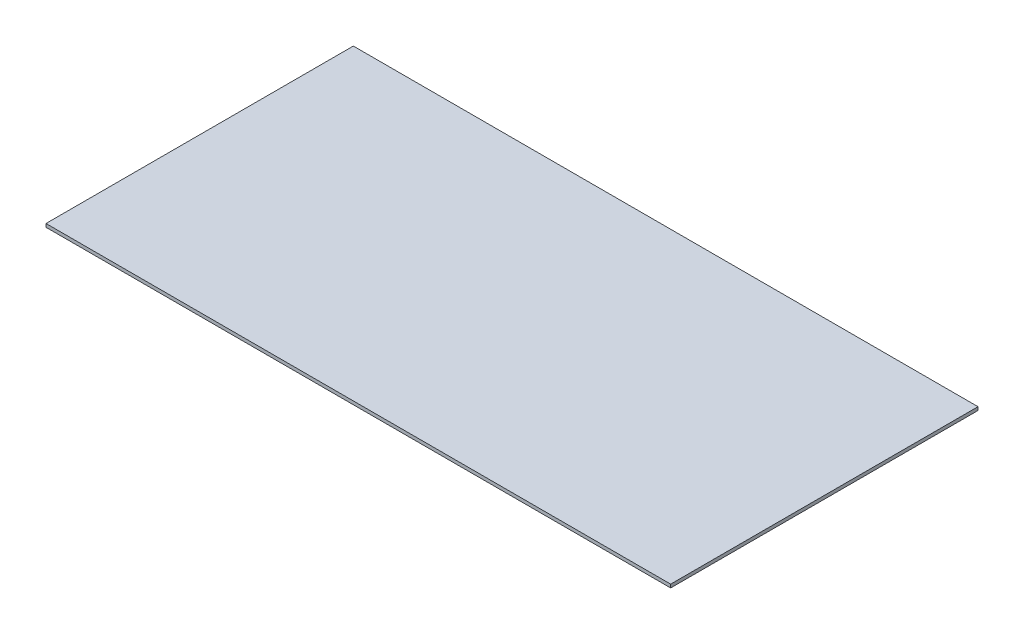
ISO-10303-21;
HEADER;
FILE_DESCRIPTION(('STEP AP214'),'2;1');
FILE_NAME('part.step','',(''),(''),'','','');
FILE_SCHEMA(('AUTOMOTIVE_DESIGN { 1 0 10303 214 1 1 1 1 }'));
ENDSEC;
DATA;
#1=APPLICATION_CONTEXT('core data for automotive mechanical design processes');
#2=APPLICATION_PROTOCOL_DEFINITION('international standard','automotive_design',2000,#1);
#3=PRODUCT_CONTEXT('',#1,'mechanical');
#4=PRODUCT('Part','Part','',(#3));
#5=PRODUCT_RELATED_PRODUCT_CATEGORY('part','',(#4));
#6=PRODUCT_DEFINITION_FORMATION('','',#4);
#7=PRODUCT_DEFINITION_CONTEXT('part definition',#1,'design');
#8=PRODUCT_DEFINITION('design','',#6,#7);
#9=PRODUCT_DEFINITION_SHAPE('','',#8);
#10=(LENGTH_UNIT() NAMED_UNIT(*) SI_UNIT(.MILLI.,.METRE.));
#11=(NAMED_UNIT(*) PLANE_ANGLE_UNIT() SI_UNIT($,.RADIAN.));
#12=(NAMED_UNIT(*) SI_UNIT($,.STERADIAN.) SOLID_ANGLE_UNIT());
#13=UNCERTAINTY_MEASURE_WITH_UNIT(LENGTH_MEASURE(1.E-05),#10,'distance_accuracy_value','');
#14=(GEOMETRIC_REPRESENTATION_CONTEXT(3) GLOBAL_UNCERTAINTY_ASSIGNED_CONTEXT((#13)) GLOBAL_UNIT_ASSIGNED_CONTEXT((#10,
#11,#12)) REPRESENTATION_CONTEXT('',''));
#15=CARTESIAN_POINT('',(0.,0.,0.));
#16=DIRECTION('',(0.,0.,1.));
#17=DIRECTION('',(1.,0.,0.));
#18=AXIS2_PLACEMENT_3D('',#15,#16,#17);
#19=CARTESIAN_POINT('',(0.,3.,0.));
#20=DIRECTION('',(1.,0.,0.));
#21=DIRECTION('',(0.,0.,-1.));
#22=AXIS2_PLACEMENT_3D('',#19,#20,#21);
#23=PLANE('',#22);
#24=DIRECTION('',(0.,0.,1.));
#25=VECTOR('',#24,1.);
#26=CARTESIAN_POINT('',(0.,0.,0.));
#27=LINE('',#26,#25);
#28=CARTESIAN_POINT('',(0.,0.,-277.));
#29=VERTEX_POINT('',#28);
#30=CARTESIAN_POINT('',(0.,0.,0.));
#31=VERTEX_POINT('',#30);
#32=EDGE_CURVE('E96',#29,#31,#27,.T.);
#33=ORIENTED_EDGE('',*,*,#32,.T.);
#34=DIRECTION('',(0.,-1.,0.));
#35=VECTOR('',#34,1.);
#36=CARTESIAN_POINT('',(0.,3.,0.));
#37=LINE('',#36,#35);
#38=CARTESIAN_POINT('',(0.,3.,0.));
#39=VERTEX_POINT('',#38);
#40=EDGE_CURVE('E11',#39,#31,#37,.T.);
#41=ORIENTED_EDGE('',*,*,#40,.F.);
#42=DIRECTION('',(0.,0.,1.));
#43=VECTOR('',#42,1.);
#44=CARTESIAN_POINT('',(0.,3.,0.));
#45=LINE('',#44,#43);
#46=CARTESIAN_POINT('',(0.,3.,-277.));
#47=VERTEX_POINT('',#46);
#48=EDGE_CURVE('E84',#47,#39,#45,.T.);
#49=ORIENTED_EDGE('',*,*,#48,.F.);
#50=DIRECTION('',(0.,-1.,0.));
#51=VECTOR('',#50,1.);
#52=CARTESIAN_POINT('',(0.,3.,-277.));
#53=LINE('',#52,#51);
#54=EDGE_CURVE('E92',#47,#29,#53,.T.);
#55=ORIENTED_EDGE('',*,*,#54,.T.);
#56=EDGE_LOOP('',(#33,#41,#49,#55));
#57=FACE_BOUND('',#56,.T.);
#58=ADVANCED_FACE('F33',(#57),#23,.F.);
#59=CARTESIAN_POINT('',(0.,3.,0.));
#60=DIRECTION('',(0.,0.,-1.));
#61=DIRECTION('',(-1.,0.,0.));
#62=AXIS2_PLACEMENT_3D('',#59,#60,#61);
#63=PLANE('',#62);
#64=DIRECTION('',(1.,0.,0.));
#65=VECTOR('',#64,1.);
#66=CARTESIAN_POINT('',(0.,0.,0.));
#67=LINE('',#66,#65);
#68=CARTESIAN_POINT('',(563.,0.,0.));
#69=VERTEX_POINT('',#68);
#70=EDGE_CURVE('E88',#31,#69,#67,.T.);
#71=ORIENTED_EDGE('',*,*,#70,.T.);
#72=DIRECTION('',(0.,-1.,0.));
#73=VECTOR('',#72,1.);
#74=CARTESIAN_POINT('',(563.,3.,0.));
#75=LINE('',#74,#73);
#76=CARTESIAN_POINT('',(563.,3.,0.));
#77=VERTEX_POINT('',#76);
#78=EDGE_CURVE('E41',#77,#69,#75,.T.);
#79=ORIENTED_EDGE('',*,*,#78,.F.);
#80=DIRECTION('',(1.,0.,0.));
#81=VECTOR('',#80,1.);
#82=CARTESIAN_POINT('',(0.,3.,0.));
#83=LINE('',#82,#81);
#84=EDGE_CURVE('E79',#39,#77,#83,.T.);
#85=ORIENTED_EDGE('',*,*,#84,.F.);
#86=ORIENTED_EDGE('',*,*,#40,.T.);
#87=EDGE_LOOP('',(#71,#79,#85,#86));
#88=FACE_BOUND('',#87,.T.);
#89=ADVANCED_FACE('F87',(#88),#63,.F.);
#90=CARTESIAN_POINT('',(563.,3.,0.));
#91=DIRECTION('',(-1.,0.,0.));
#92=DIRECTION('',(0.,0.,1.));
#93=AXIS2_PLACEMENT_3D('',#90,#91,#92);
#94=PLANE('',#93);
#95=DIRECTION('',(0.,0.,-1.));
#96=VECTOR('',#95,1.);
#97=CARTESIAN_POINT('',(563.,0.,0.));
#98=LINE('',#97,#96);
#99=CARTESIAN_POINT('',(563.,0.,-277.));
#100=VERTEX_POINT('',#99);
#101=EDGE_CURVE('E66',#69,#100,#98,.T.);
#102=ORIENTED_EDGE('',*,*,#101,.T.);
#103=DIRECTION('',(0.,-1.,0.));
#104=VECTOR('',#103,1.);
#105=CARTESIAN_POINT('',(563.,3.,-277.));
#106=LINE('',#105,#104);
#107=CARTESIAN_POINT('',(563.,3.,-277.));
#108=VERTEX_POINT('',#107);
#109=EDGE_CURVE('E89',#108,#100,#106,.T.);
#110=ORIENTED_EDGE('',*,*,#109,.F.);
#111=DIRECTION('',(0.,0.,-1.));
#112=VECTOR('',#111,1.);
#113=CARTESIAN_POINT('',(563.,3.,0.));
#114=LINE('',#113,#112);
#115=EDGE_CURVE('E82',#77,#108,#114,.T.);
#116=ORIENTED_EDGE('',*,*,#115,.F.);
#117=ORIENTED_EDGE('',*,*,#78,.T.);
#118=EDGE_LOOP('',(#102,#110,#116,#117));
#119=FACE_BOUND('',#118,.T.);
#120=ADVANCED_FACE('F90',(#119),#94,.F.);
#121=CARTESIAN_POINT('',(0.,3.,-277.));
#122=DIRECTION('',(0.,0.,1.));
#123=DIRECTION('',(1.,0.,0.));
#124=AXIS2_PLACEMENT_3D('',#121,#122,#123);
#125=PLANE('',#124);
#126=DIRECTION('',(-1.,0.,0.));
#127=VECTOR('',#126,1.);
#128=CARTESIAN_POINT('',(0.,0.,-277.));
#129=LINE('',#128,#127);
#130=EDGE_CURVE('E72',#100,#29,#129,.T.);
#131=ORIENTED_EDGE('',*,*,#130,.T.);
#132=ORIENTED_EDGE('',*,*,#54,.F.);
#133=DIRECTION('',(-1.,0.,0.));
#134=VECTOR('',#133,1.);
#135=CARTESIAN_POINT('',(0.,3.,-277.));
#136=LINE('',#135,#134);
#137=EDGE_CURVE('E49',#108,#47,#136,.T.);
#138=ORIENTED_EDGE('',*,*,#137,.F.);
#139=ORIENTED_EDGE('',*,*,#109,.T.);
#140=EDGE_LOOP('',(#131,#132,#138,#139));
#141=FACE_BOUND('',#140,.T.);
#142=ADVANCED_FACE('F103',(#141),#125,.F.);
#143=CARTESIAN_POINT('',(0.,3.,0.));
#144=DIRECTION('',(0.,-1.,0.));
#145=DIRECTION('',(0.,0.,-1.));
#146=AXIS2_PLACEMENT_3D('',#143,#144,#145);
#147=PLANE('',#146);
#148=ORIENTED_EDGE('',*,*,#48,.T.);
#149=ORIENTED_EDGE('',*,*,#84,.T.);
#150=ORIENTED_EDGE('',*,*,#115,.T.);
#151=ORIENTED_EDGE('',*,*,#137,.T.);
#152=EDGE_LOOP('',(#148,#149,#150,#151));
#153=FACE_BOUND('',#152,.T.);
#154=ADVANCED_FACE('F80',(#153),#147,.F.);
#155=CARTESIAN_POINT('',(0.,0.,0.));
#156=DIRECTION('',(0.,-1.,0.));
#157=DIRECTION('',(0.,0.,-1.));
#158=AXIS2_PLACEMENT_3D('',#155,#156,#157);
#159=PLANE('',#158);
#160=ORIENTED_EDGE('',*,*,#32,.F.);
#161=ORIENTED_EDGE('',*,*,#130,.F.);
#162=ORIENTED_EDGE('',*,*,#101,.F.);
#163=ORIENTED_EDGE('',*,*,#70,.F.);
#164=EDGE_LOOP('',(#160,#161,#162,#163));
#165=FACE_BOUND('',#164,.T.);
#166=ADVANCED_FACE('F106',(#165),#159,.T.);
#167=CLOSED_SHELL('',(#58,#89,#120,#142,#154,#166));
#168=MANIFOLD_SOLID_BREP('B2',#167);
#169=ADVANCED_BREP_SHAPE_REPRESENTATION('',(#18,#168),#14);
#170=SHAPE_DEFINITION_REPRESENTATION(#9,#169);
ENDSEC;
END-ISO-10303-21;
